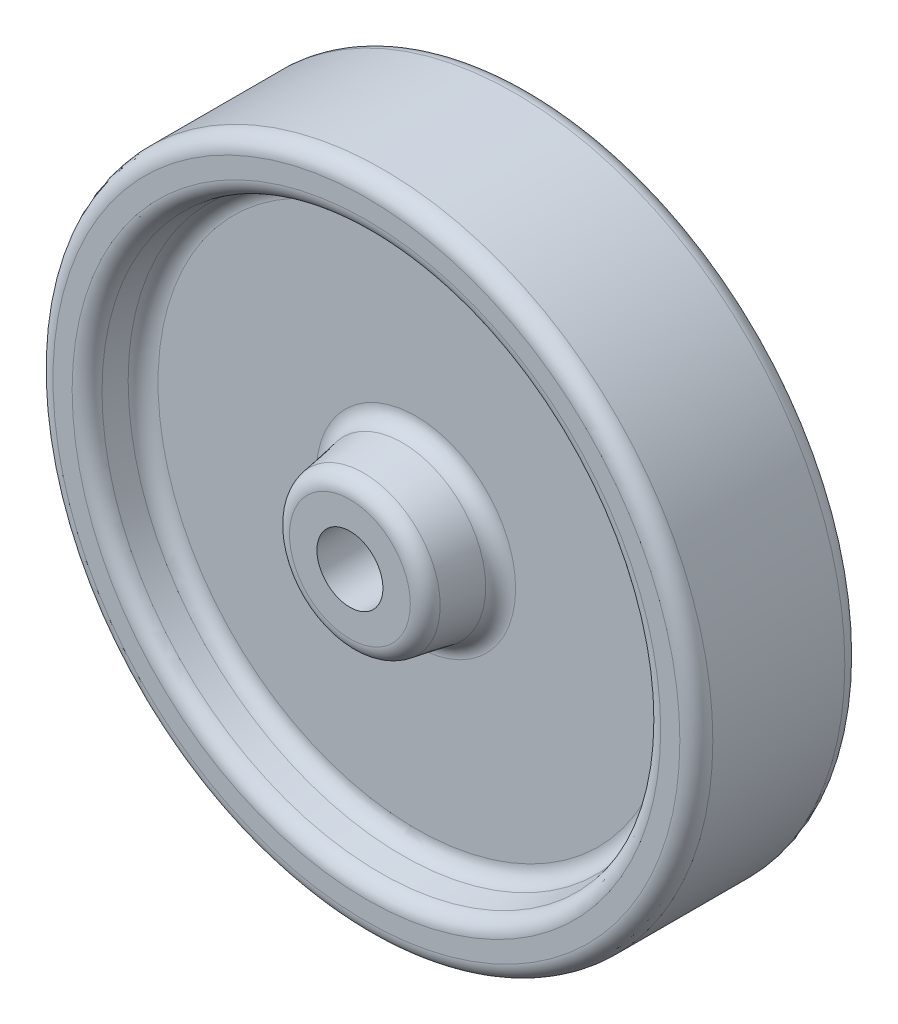
ISO-10303-21;
HEADER;
FILE_DESCRIPTION(('STEP AP214'),'2;1');
FILE_NAME('part.step','',(''),(''),'','','');
FILE_SCHEMA(('AUTOMOTIVE_DESIGN { 1 0 10303 214 1 1 1 1 }'));
ENDSEC;
DATA;
#1=APPLICATION_CONTEXT('core data for automotive mechanical design processes');
#2=APPLICATION_PROTOCOL_DEFINITION('international standard','automotive_design',2000,#1);
#3=PRODUCT_CONTEXT('',#1,'mechanical');
#4=PRODUCT('Part','Part','',(#3));
#5=PRODUCT_RELATED_PRODUCT_CATEGORY('part','',(#4));
#6=PRODUCT_DEFINITION_FORMATION('','',#4);
#7=PRODUCT_DEFINITION_CONTEXT('part definition',#1,'design');
#8=PRODUCT_DEFINITION('design','',#6,#7);
#9=PRODUCT_DEFINITION_SHAPE('','',#8);
#10=(LENGTH_UNIT() NAMED_UNIT(*) SI_UNIT(.MILLI.,.METRE.));
#11=(NAMED_UNIT(*) PLANE_ANGLE_UNIT() SI_UNIT($,.RADIAN.));
#12=(NAMED_UNIT(*) SI_UNIT($,.STERADIAN.) SOLID_ANGLE_UNIT());
#13=UNCERTAINTY_MEASURE_WITH_UNIT(LENGTH_MEASURE(1.E-05),#10,'distance_accuracy_value','');
#14=(GEOMETRIC_REPRESENTATION_CONTEXT(3) GLOBAL_UNCERTAINTY_ASSIGNED_CONTEXT((#13)) GLOBAL_UNIT_ASSIGNED_CONTEXT((#10,
#11,#12)) REPRESENTATION_CONTEXT('',''));
#15=CARTESIAN_POINT('',(0.,0.,0.));
#16=DIRECTION('',(0.,0.,1.));
#17=DIRECTION('',(1.,0.,0.));
#18=AXIS2_PLACEMENT_3D('',#15,#16,#17);
#19=CARTESIAN_POINT('',(0.,12.4999999999998,30.0000000000001));
#20=DIRECTION('',(0.,0.,-1.));
#21=DIRECTION('',(-1.,0.,0.));
#22=AXIS2_PLACEMENT_3D('',#19,#20,#21);
#23=PLANE('',#22);
#24=CARTESIAN_POINT('',(0.,0.,30.0000000000001));
#25=DIRECTION('',(0.,0.,1.));
#26=DIRECTION('',(1.,0.,0.));
#27=AXIS2_PLACEMENT_3D('',#24,#25,#26);
#28=CIRCLE('',#27,18.3045018441133);
#29=CARTESIAN_POINT('',(18.3045018441133,0.,30.0000000000001));
#30=VERTEX_POINT('',#29);
#31=EDGE_CURVE('E10',#30,#30,#28,.T.);
#32=ORIENTED_EDGE('',*,*,#31,.T.);
#33=EDGE_LOOP('',(#32));
#34=FACE_BOUND('',#33,.T.);
#35=CARTESIAN_POINT('',(0.,0.,30.0000000000001));
#36=DIRECTION('',(0.,0.,-1.));
#37=DIRECTION('',(-1.,0.,0.));
#38=AXIS2_PLACEMENT_3D('',#35,#36,#37);
#39=CIRCLE('',#38,10.);
#40=CARTESIAN_POINT('',(-10.,0.,30.0000000000001));
#41=VERTEX_POINT('',#40);
#42=EDGE_CURVE('E106',#41,#41,#39,.F.);
#43=ORIENTED_EDGE('',*,*,#42,.F.);
#44=EDGE_LOOP('',(#43));
#45=FACE_BOUND('',#44,.T.);
#46=ADVANCED_FACE('F39',(#34,#45),#23,.F.);
#47=CARTESIAN_POINT('',(0.,0.,25.0000000000001));
#48=DIRECTION('',(0.,0.,1.));
#49=DIRECTION('',(1.,0.,0.));
#50=AXIS2_PLACEMENT_3D('',#47,#48,#49);
#51=TOROIDAL_SURFACE('',#50,18.3045018441134,5.);
#52=ORIENTED_EDGE('',*,*,#31,.F.);
#53=EDGE_LOOP('',(#52));
#54=FACE_BOUND('',#53,.T.);
#55=CARTESIAN_POINT('',(0.,0.,25.8682408883348));
#56=DIRECTION('',(0.,0.,1.));
#57=DIRECTION('',(1.,0.,0.));
#58=AXIS2_PLACEMENT_3D('',#55,#56,#57);
#59=CIRCLE('',#58,23.2285406091744);
#60=CARTESIAN_POINT('',(23.2285406091744,0.,25.8682408883348));
#61=VERTEX_POINT('',#60);
#62=EDGE_CURVE('E45',#61,#61,#59,.T.);
#63=ORIENTED_EDGE('',*,*,#62,.T.);
#64=EDGE_LOOP('',(#63));
#65=FACE_BOUND('',#64,.T.);
#66=ADVANCED_FACE('F131',(#54,#65),#51,.T.);
#67=CARTESIAN_POINT('',(0.,0.,14.1317591116656));
#68=DIRECTION('',(0.,0.,-1.));
#69=DIRECTION('',(-1.,0.,0.));
#70=AXIS2_PLACEMENT_3D('',#67,#68,#69);
#71=CONICAL_SURFACE('',#70,25.2979990049945,0.174532925199436);
#72=ORIENTED_EDGE('',*,*,#62,.F.);
#73=EDGE_LOOP('',(#72));
#74=FACE_BOUND('',#73,.T.);
#75=CARTESIAN_POINT('',(0.,0.,14.1317591116656));
#76=DIRECTION('',(0.,0.,1.));
#77=DIRECTION('',(1.,0.,0.));
#78=AXIS2_PLACEMENT_3D('',#75,#76,#77);
#79=CIRCLE('',#78,25.2979990049945);
#80=CARTESIAN_POINT('',(25.2979990049945,0.,14.1317591116656));
#81=VERTEX_POINT('',#80);
#82=EDGE_CURVE('E49',#81,#81,#79,.T.);
#83=ORIENTED_EDGE('',*,*,#82,.T.);
#84=EDGE_LOOP('',(#83));
#85=FACE_BOUND('',#84,.T.);
#86=ADVANCED_FACE('F135',(#74,#85),#71,.T.);
#87=CARTESIAN_POINT('',(0.,0.,15.0000000000002));
#88=DIRECTION('',(0.,0.,1.));
#89=DIRECTION('',(1.,0.,0.));
#90=AXIS2_PLACEMENT_3D('',#87,#88,#89);
#91=TOROIDAL_SURFACE('',#90,30.2220377700555,5.);
#92=ORIENTED_EDGE('',*,*,#82,.F.);
#93=EDGE_LOOP('',(#92));
#94=FACE_BOUND('',#93,.T.);
#95=CARTESIAN_POINT('',(0.,0.,10.0000000000002));
#96=DIRECTION('',(0.,0.,1.));
#97=DIRECTION('',(1.,0.,0.));
#98=AXIS2_PLACEMENT_3D('',#95,#96,#97);
#99=CIRCLE('',#98,30.2220377700556);
#100=CARTESIAN_POINT('',(30.2220377700556,0.,10.0000000000002));
#101=VERTEX_POINT('',#100);
#102=EDGE_CURVE('E53',#101,#101,#99,.T.);
#103=ORIENTED_EDGE('',*,*,#102,.T.);
#104=EDGE_LOOP('',(#103));
#105=FACE_BOUND('',#104,.T.);
#106=ADVANCED_FACE('F142',(#94,#105),#91,.F.);
#107=CARTESIAN_POINT('',(0.,78.1595971334866,10.0000000000004));
#108=DIRECTION('',(0.,0.,-1.));
#109=DIRECTION('',(-1.,0.,0.));
#110=AXIS2_PLACEMENT_3D('',#107,#108,#109);
#111=PLANE('',#110);
#112=ORIENTED_EDGE('',*,*,#102,.F.);
#113=EDGE_LOOP('',(#112));
#114=FACE_BOUND('',#113,.T.);
#115=CARTESIAN_POINT('',(0.,0.,10.0000000000005));
#116=DIRECTION('',(0.,0.,1.));
#117=DIRECTION('',(1.,0.,0.));
#118=AXIS2_PLACEMENT_3D('',#115,#116,#117);
#119=CIRCLE('',#118,78.1595971334866);
#120=CARTESIAN_POINT('',(78.1595971334866,0.,10.0000000000005));
#121=VERTEX_POINT('',#120);
#122=EDGE_CURVE('E58',#121,#121,#119,.T.);
#123=ORIENTED_EDGE('',*,*,#122,.T.);
#124=EDGE_LOOP('',(#123));
#125=FACE_BOUND('',#124,.T.);
#126=ADVANCED_FACE('F148',(#114,#125),#111,.F.);
#127=CARTESIAN_POINT('',(0.,0.,15.0000000000005));
#128=DIRECTION('',(0.,0.,1.));
#129=DIRECTION('',(1.,0.,0.));
#130=AXIS2_PLACEMENT_3D('',#127,#128,#129);
#131=TOROIDAL_SURFACE('',#130,78.1595971334866,5.);
#132=ORIENTED_EDGE('',*,*,#122,.F.);
#133=EDGE_LOOP('',(#132));
#134=FACE_BOUND('',#133,.T.);
#135=CARTESIAN_POINT('',(0.,0.,14.131759111666));
#136=DIRECTION('',(0.,0.,1.));
#137=DIRECTION('',(1.,0.,0.));
#138=AXIS2_PLACEMENT_3D('',#135,#136,#137);
#139=CIRCLE('',#138,83.0836358985476);
#140=CARTESIAN_POINT('',(83.0836358985476,0.,14.131759111666));
#141=VERTEX_POINT('',#140);
#142=EDGE_CURVE('E61',#141,#141,#139,.T.);
#143=ORIENTED_EDGE('',*,*,#142,.T.);
#144=EDGE_LOOP('',(#143));
#145=FACE_BOUND('',#144,.T.);
#146=ADVANCED_FACE('F152',(#134,#145),#131,.F.);
#147=CARTESIAN_POINT('',(0.,0.,20.8682408883352));
#148=DIRECTION('',(0.,0.,1.));
#149=DIRECTION('',(1.,0.,0.));
#150=AXIS2_PLACEMENT_3D('',#147,#148,#149);
#151=CONICAL_SURFACE('',#150,84.2714593908252,0.174532925199425);
#152=ORIENTED_EDGE('',*,*,#142,.F.);
#153=EDGE_LOOP('',(#152));
#154=FACE_BOUND('',#153,.T.);
#155=CARTESIAN_POINT('',(0.,0.,20.8682408883352));
#156=DIRECTION('',(0.,0.,1.));
#157=DIRECTION('',(1.,0.,0.));
#158=AXIS2_PLACEMENT_3D('',#155,#156,#157);
#159=CIRCLE('',#158,84.2714593908252);
#160=CARTESIAN_POINT('',(84.2714593908252,0.,20.8682408883352));
#161=VERTEX_POINT('',#160);
#162=EDGE_CURVE('E64',#161,#161,#159,.T.);
#163=ORIENTED_EDGE('',*,*,#162,.T.);
#164=EDGE_LOOP('',(#163));
#165=FACE_BOUND('',#164,.T.);
#166=ADVANCED_FACE('F156',(#154,#165),#151,.F.);
#167=CARTESIAN_POINT('',(0.,0.,20.0000000000006));
#168=DIRECTION('',(0.,0.,1.));
#169=DIRECTION('',(1.,0.,0.));
#170=AXIS2_PLACEMENT_3D('',#167,#168,#169);
#171=TOROIDAL_SURFACE('',#170,89.1954981558863,5.);
#172=ORIENTED_EDGE('',*,*,#162,.F.);
#173=EDGE_LOOP('',(#172));
#174=FACE_BOUND('',#173,.T.);
#175=CARTESIAN_POINT('',(0.,0.,25.0000000000006));
#176=DIRECTION('',(0.,0.,1.));
#177=DIRECTION('',(1.,0.,0.));
#178=AXIS2_PLACEMENT_3D('',#175,#176,#177);
#179=CIRCLE('',#178,89.1954981558863);
#180=CARTESIAN_POINT('',(89.1954981558863,0.,25.0000000000006));
#181=VERTEX_POINT('',#180);
#182=EDGE_CURVE('E67',#181,#181,#179,.T.);
#183=ORIENTED_EDGE('',*,*,#182,.T.);
#184=EDGE_LOOP('',(#183));
#185=FACE_BOUND('',#184,.T.);
#186=ADVANCED_FACE('F160',(#174,#185),#171,.T.);
#187=CARTESIAN_POINT('',(0.,94.9999999999998,25.0000000000007));
#188=DIRECTION('',(0.,0.,-1.));
#189=DIRECTION('',(-1.,0.,0.));
#190=AXIS2_PLACEMENT_3D('',#187,#188,#189);
#191=PLANE('',#190);
#192=ORIENTED_EDGE('',*,*,#182,.F.);
#193=EDGE_LOOP('',(#192));
#194=FACE_BOUND('',#193,.T.);
#195=CARTESIAN_POINT('',(0.,0.,25.0000000000007));
#196=DIRECTION('',(0.,0.,1.));
#197=DIRECTION('',(1.,0.,0.));
#198=AXIS2_PLACEMENT_3D('',#195,#196,#197);
#199=CIRCLE('',#198,94.9999999999998);
#200=CARTESIAN_POINT('',(94.9999999999998,0.,25.0000000000007));
#201=VERTEX_POINT('',#200);
#202=EDGE_CURVE('E70',#201,#201,#199,.T.);
#203=ORIENTED_EDGE('',*,*,#202,.T.);
#204=EDGE_LOOP('',(#203));
#205=FACE_BOUND('',#204,.T.);
#206=ADVANCED_FACE('F164',(#194,#205),#191,.F.);
#207=CARTESIAN_POINT('',(0.,0.,20.0000000000007));
#208=DIRECTION('',(0.,0.,1.));
#209=DIRECTION('',(1.,0.,0.));
#210=AXIS2_PLACEMENT_3D('',#207,#208,#209);
#211=TOROIDAL_SURFACE('',#210,94.9999999999999,5.);
#212=ORIENTED_EDGE('',*,*,#202,.F.);
#213=EDGE_LOOP('',(#212));
#214=FACE_BOUND('',#213,.T.);
#215=CARTESIAN_POINT('',(0.,0.,20.0000000000007));
#216=DIRECTION('',(0.,0.,1.));
#217=DIRECTION('',(1.,0.,0.));
#218=AXIS2_PLACEMENT_3D('',#215,#216,#217);
#219=CIRCLE('',#218,99.9999999999999);
#220=CARTESIAN_POINT('',(99.9999999999999,0.,20.0000000000007));
#221=VERTEX_POINT('',#220);
#222=EDGE_CURVE('E73',#221,#221,#219,.T.);
#223=ORIENTED_EDGE('',*,*,#222,.T.);
#224=EDGE_LOOP('',(#223));
#225=FACE_BOUND('',#224,.T.);
#226=ADVANCED_FACE('F168',(#214,#225),#211,.T.);
#227=CARTESIAN_POINT('',(0.,0.,0.));
#228=DIRECTION('',(0.,0.,1.));
#229=DIRECTION('',(1.,0.,0.));
#230=AXIS2_PLACEMENT_3D('',#227,#228,#229);
#231=CYLINDRICAL_SURFACE('',#230,99.9999999999999);
#232=ORIENTED_EDGE('',*,*,#222,.F.);
#233=EDGE_LOOP('',(#232));
#234=FACE_BOUND('',#233,.T.);
#235=CARTESIAN_POINT('',(0.,0.,-20.));
#236=DIRECTION('',(0.,0.,1.));
#237=DIRECTION('',(1.,0.,0.));
#238=AXIS2_PLACEMENT_3D('',#235,#236,#237);
#239=CIRCLE('',#238,100.);
#240=CARTESIAN_POINT('',(100.,0.,-20.));
#241=VERTEX_POINT('',#240);
#242=EDGE_CURVE('E76',#241,#241,#239,.T.);
#243=ORIENTED_EDGE('',*,*,#242,.T.);
#244=EDGE_LOOP('',(#243));
#245=FACE_BOUND('',#244,.T.);
#246=ADVANCED_FACE('F172',(#234,#245),#231,.T.);
#247=CARTESIAN_POINT('',(0.,0.,-20.));
#248=DIRECTION('',(0.,0.,1.));
#249=DIRECTION('',(1.,0.,0.));
#250=AXIS2_PLACEMENT_3D('',#247,#248,#249);
#251=TOROIDAL_SURFACE('',#250,95.,5.);
#252=ORIENTED_EDGE('',*,*,#242,.F.);
#253=EDGE_LOOP('',(#252));
#254=FACE_BOUND('',#253,.T.);
#255=CARTESIAN_POINT('',(0.,0.,-25.));
#256=DIRECTION('',(0.,0.,1.));
#257=DIRECTION('',(1.,0.,0.));
#258=AXIS2_PLACEMENT_3D('',#255,#256,#257);
#259=CIRCLE('',#258,95.);
#260=CARTESIAN_POINT('',(95.,0.,-25.));
#261=VERTEX_POINT('',#260);
#262=EDGE_CURVE('E79',#261,#261,#259,.T.);
#263=ORIENTED_EDGE('',*,*,#262,.T.);
#264=EDGE_LOOP('',(#263));
#265=FACE_BOUND('',#264,.T.);
#266=ADVANCED_FACE('F176',(#254,#265),#251,.T.);
#267=CARTESIAN_POINT('',(0.,95.,-25.));
#268=DIRECTION('',(0.,0.,1.));
#269=DIRECTION('',(1.,0.,0.));
#270=AXIS2_PLACEMENT_3D('',#267,#268,#269);
#271=PLANE('',#270);
#272=ORIENTED_EDGE('',*,*,#262,.F.);
#273=EDGE_LOOP('',(#272));
#274=FACE_BOUND('',#273,.T.);
#275=CARTESIAN_POINT('',(0.,0.,-25.));
#276=DIRECTION('',(0.,0.,1.));
#277=DIRECTION('',(1.,0.,0.));
#278=AXIS2_PLACEMENT_3D('',#275,#276,#277);
#279=CIRCLE('',#278,89.1954981558865);
#280=CARTESIAN_POINT('',(89.1954981558865,0.,-25.));
#281=VERTEX_POINT('',#280);
#282=EDGE_CURVE('E82',#281,#281,#279,.T.);
#283=ORIENTED_EDGE('',*,*,#282,.T.);
#284=EDGE_LOOP('',(#283));
#285=FACE_BOUND('',#284,.T.);
#286=ADVANCED_FACE('F180',(#274,#285),#271,.F.);
#287=CARTESIAN_POINT('',(0.,0.,-20.));
#288=DIRECTION('',(0.,0.,1.));
#289=DIRECTION('',(1.,0.,0.));
#290=AXIS2_PLACEMENT_3D('',#287,#288,#289);
#291=TOROIDAL_SURFACE('',#290,89.1954981558864,5.);
#292=ORIENTED_EDGE('',*,*,#282,.F.);
#293=EDGE_LOOP('',(#292));
#294=FACE_BOUND('',#293,.T.);
#295=CARTESIAN_POINT('',(0.,0.,-20.8682408883346));
#296=DIRECTION('',(0.,0.,1.));
#297=DIRECTION('',(1.,0.,0.));
#298=AXIS2_PLACEMENT_3D('',#295,#296,#297);
#299=CIRCLE('',#298,84.2714593908254);
#300=CARTESIAN_POINT('',(84.2714593908254,0.,-20.8682408883346));
#301=VERTEX_POINT('',#300);
#302=EDGE_CURVE('E85',#301,#301,#299,.T.);
#303=ORIENTED_EDGE('',*,*,#302,.T.);
#304=EDGE_LOOP('',(#303));
#305=FACE_BOUND('',#304,.T.);
#306=ADVANCED_FACE('F184',(#294,#305),#291,.T.);
#307=CARTESIAN_POINT('',(0.,0.,-14.1317591116654));
#308=DIRECTION('',(0.,0.,-1.));
#309=DIRECTION('',(-1.,0.,0.));
#310=AXIS2_PLACEMENT_3D('',#307,#308,#309);
#311=CONICAL_SURFACE('',#310,83.0836358985477,0.174532925199429);
#312=ORIENTED_EDGE('',*,*,#302,.F.);
#313=EDGE_LOOP('',(#312));
#314=FACE_BOUND('',#313,.T.);
#315=CARTESIAN_POINT('',(0.,0.,-14.1317591116654));
#316=DIRECTION('',(0.,0.,1.));
#317=DIRECTION('',(1.,0.,0.));
#318=AXIS2_PLACEMENT_3D('',#315,#316,#317);
#319=CIRCLE('',#318,83.0836358985477);
#320=CARTESIAN_POINT('',(83.0836358985477,0.,-14.1317591116654));
#321=VERTEX_POINT('',#320);
#322=EDGE_CURVE('E88',#321,#321,#319,.T.);
#323=ORIENTED_EDGE('',*,*,#322,.T.);
#324=EDGE_LOOP('',(#323));
#325=FACE_BOUND('',#324,.T.);
#326=ADVANCED_FACE('F188',(#314,#325),#311,.F.);
#327=CARTESIAN_POINT('',(0.,0.,-15.));
#328=DIRECTION('',(0.,0.,1.));
#329=DIRECTION('',(1.,0.,0.));
#330=AXIS2_PLACEMENT_3D('',#327,#328,#329);
#331=TOROIDAL_SURFACE('',#330,78.1595971334867,5.);
#332=ORIENTED_EDGE('',*,*,#322,.F.);
#333=EDGE_LOOP('',(#332));
#334=FACE_BOUND('',#333,.T.);
#335=CARTESIAN_POINT('',(0.,0.,-10.));
#336=DIRECTION('',(0.,0.,1.));
#337=DIRECTION('',(1.,0.,0.));
#338=AXIS2_PLACEMENT_3D('',#335,#336,#337);
#339=CIRCLE('',#338,78.1595971334866);
#340=CARTESIAN_POINT('',(78.1595971334866,0.,-10.));
#341=VERTEX_POINT('',#340);
#342=EDGE_CURVE('E91',#341,#341,#339,.T.);
#343=ORIENTED_EDGE('',*,*,#342,.T.);
#344=EDGE_LOOP('',(#343));
#345=FACE_BOUND('',#344,.T.);
#346=ADVANCED_FACE('F192',(#334,#345),#331,.F.);
#347=CARTESIAN_POINT('',(0.,78.1595971334866,-10.));
#348=DIRECTION('',(0.,0.,1.));
#349=DIRECTION('',(1.,0.,0.));
#350=AXIS2_PLACEMENT_3D('',#347,#348,#349);
#351=PLANE('',#350);
#352=ORIENTED_EDGE('',*,*,#342,.F.);
#353=EDGE_LOOP('',(#352));
#354=FACE_BOUND('',#353,.T.);
#355=CARTESIAN_POINT('',(0.,0.,-10.));
#356=DIRECTION('',(0.,0.,1.));
#357=DIRECTION('',(1.,0.,0.));
#358=AXIS2_PLACEMENT_3D('',#355,#356,#357);
#359=CIRCLE('',#358,30.2220377700557);
#360=CARTESIAN_POINT('',(30.2220377700557,0.,-10.));
#361=VERTEX_POINT('',#360);
#362=EDGE_CURVE('E94',#361,#361,#359,.T.);
#363=ORIENTED_EDGE('',*,*,#362,.T.);
#364=EDGE_LOOP('',(#363));
#365=FACE_BOUND('',#364,.T.);
#366=ADVANCED_FACE('F196',(#354,#365),#351,.F.);
#367=CARTESIAN_POINT('',(0.,0.,-15.));
#368=DIRECTION('',(0.,0.,1.));
#369=DIRECTION('',(1.,0.,0.));
#370=AXIS2_PLACEMENT_3D('',#367,#368,#369);
#371=TOROIDAL_SURFACE('',#370,30.2220377700556,5.);
#372=ORIENTED_EDGE('',*,*,#362,.F.);
#373=EDGE_LOOP('',(#372));
#374=FACE_BOUND('',#373,.T.);
#375=CARTESIAN_POINT('',(0.,0.,-14.1317591116654));
#376=DIRECTION('',(0.,0.,1.));
#377=DIRECTION('',(1.,0.,0.));
#378=AXIS2_PLACEMENT_3D('',#375,#376,#377);
#379=CIRCLE('',#378,25.2979990049946);
#380=CARTESIAN_POINT('',(25.2979990049946,0.,-14.1317591116654));
#381=VERTEX_POINT('',#380);
#382=EDGE_CURVE('E97',#381,#381,#379,.T.);
#383=ORIENTED_EDGE('',*,*,#382,.T.);
#384=EDGE_LOOP('',(#383));
#385=FACE_BOUND('',#384,.T.);
#386=ADVANCED_FACE('F200',(#374,#385),#371,.F.);
#387=CARTESIAN_POINT('',(0.,0.,-25.8682408883346));
#388=DIRECTION('',(0.,0.,1.));
#389=DIRECTION('',(1.,0.,0.));
#390=AXIS2_PLACEMENT_3D('',#387,#388,#389);
#391=CONICAL_SURFACE('',#390,23.2285406091746,0.174532925199429);
#392=ORIENTED_EDGE('',*,*,#382,.F.);
#393=EDGE_LOOP('',(#392));
#394=FACE_BOUND('',#393,.T.);
#395=CARTESIAN_POINT('',(0.,0.,-25.8682408883346));
#396=DIRECTION('',(0.,0.,1.));
#397=DIRECTION('',(1.,0.,0.));
#398=AXIS2_PLACEMENT_3D('',#395,#396,#397);
#399=CIRCLE('',#398,23.2285406091746);
#400=CARTESIAN_POINT('',(23.2285406091746,0.,-25.8682408883346));
#401=VERTEX_POINT('',#400);
#402=EDGE_CURVE('E100',#401,#401,#399,.T.);
#403=ORIENTED_EDGE('',*,*,#402,.T.);
#404=EDGE_LOOP('',(#403));
#405=FACE_BOUND('',#404,.T.);
#406=ADVANCED_FACE('F126',(#394,#405),#391,.T.);
#407=CARTESIAN_POINT('',(0.,0.,-25.));
#408=DIRECTION('',(0.,0.,1.));
#409=DIRECTION('',(1.,0.,0.));
#410=AXIS2_PLACEMENT_3D('',#407,#408,#409);
#411=TOROIDAL_SURFACE('',#410,18.3045018441136,5.);
#412=ORIENTED_EDGE('',*,*,#402,.F.);
#413=EDGE_LOOP('',(#412));
#414=FACE_BOUND('',#413,.T.);
#415=CARTESIAN_POINT('',(0.,0.,-30.));
#416=DIRECTION('',(0.,0.,1.));
#417=DIRECTION('',(1.,0.,0.));
#418=AXIS2_PLACEMENT_3D('',#415,#416,#417);
#419=CIRCLE('',#418,18.3045018441136);
#420=CARTESIAN_POINT('',(18.3045018441136,0.,-30.));
#421=VERTEX_POINT('',#420);
#422=EDGE_CURVE('E103',#421,#421,#419,.T.);
#423=ORIENTED_EDGE('',*,*,#422,.T.);
#424=EDGE_LOOP('',(#423));
#425=FACE_BOUND('',#424,.T.);
#426=ADVANCED_FACE('F117',(#414,#425),#411,.T.);
#427=CARTESIAN_POINT('',(0.,12.5,-30.));
#428=DIRECTION('',(0.,0.,1.));
#429=DIRECTION('',(1.,0.,0.));
#430=AXIS2_PLACEMENT_3D('',#427,#428,#429);
#431=PLANE('',#430);
#432=ORIENTED_EDGE('',*,*,#422,.F.);
#433=EDGE_LOOP('',(#432));
#434=FACE_BOUND('',#433,.T.);
#435=CARTESIAN_POINT('',(0.,0.,-30.));
#436=DIRECTION('',(0.,0.,-1.));
#437=DIRECTION('',(-1.,0.,0.));
#438=AXIS2_PLACEMENT_3D('',#435,#436,#437);
#439=CIRCLE('',#438,10.);
#440=CARTESIAN_POINT('',(-10.,0.,-30.));
#441=VERTEX_POINT('',#440);
#442=EDGE_CURVE('E109',#441,#441,#439,.T.);
#443=ORIENTED_EDGE('',*,*,#442,.F.);
#444=EDGE_LOOP('',(#443));
#445=FACE_BOUND('',#444,.T.);
#446=ADVANCED_FACE('F115',(#434,#445),#431,.F.);
#447=CARTESIAN_POINT('',(0.,0.,65.3553390593275));
#448=DIRECTION('',(0.,0.,-1.));
#449=DIRECTION('',(-1.,0.,0.));
#450=AXIS2_PLACEMENT_3D('',#447,#448,#449);
#451=CYLINDRICAL_SURFACE('',#450,10.);
#452=ORIENTED_EDGE('',*,*,#42,.T.);
#453=EDGE_LOOP('',(#452));
#454=FACE_BOUND('',#453,.T.);
#455=ORIENTED_EDGE('',*,*,#442,.T.);
#456=EDGE_LOOP('',(#455));
#457=FACE_BOUND('',#456,.T.);
#458=ADVANCED_FACE('F113',(#454,#457),#451,.F.);
#459=CLOSED_SHELL('',(#46,#66,#86,#106,#126,#146,#166,#186,#206,#226,#246,#266,#286,#306,#326,
#346,#366,#386,#406,#426,#446,#458));
#460=MANIFOLD_SOLID_BREP('B2',#459);
#461=ADVANCED_BREP_SHAPE_REPRESENTATION('',(#18,#460),#14);
#462=SHAPE_DEFINITION_REPRESENTATION(#9,#461);
ENDSEC;
END-ISO-10303-21;
